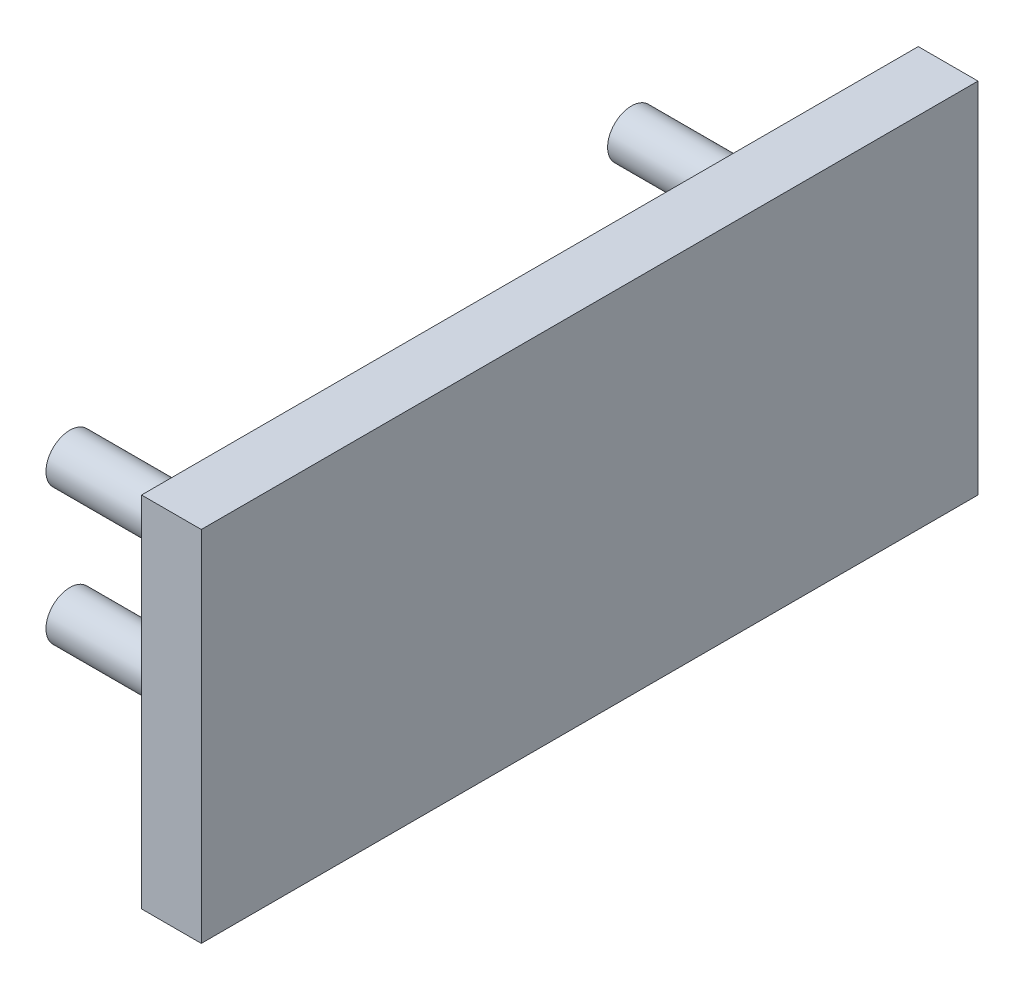
ISO-10303-21;
HEADER;
FILE_DESCRIPTION(('STEP AP214'),'2;1');
FILE_NAME('part.step','',(''),(''),'','','');
FILE_SCHEMA(('AUTOMOTIVE_DESIGN { 1 0 10303 214 1 1 1 1 }'));
ENDSEC;
DATA;
#1=APPLICATION_CONTEXT('core data for automotive mechanical design processes');
#2=APPLICATION_PROTOCOL_DEFINITION('international standard','automotive_design',2000,#1);
#3=PRODUCT_CONTEXT('',#1,'mechanical');
#4=PRODUCT('Part','Part','',(#3));
#5=PRODUCT_RELATED_PRODUCT_CATEGORY('part','',(#4));
#6=PRODUCT_DEFINITION_FORMATION('','',#4);
#7=PRODUCT_DEFINITION_CONTEXT('part definition',#1,'design');
#8=PRODUCT_DEFINITION('design','',#6,#7);
#9=PRODUCT_DEFINITION_SHAPE('','',#8);
#10=(LENGTH_UNIT() NAMED_UNIT(*) SI_UNIT(.MILLI.,.METRE.));
#11=(NAMED_UNIT(*) PLANE_ANGLE_UNIT() SI_UNIT($,.RADIAN.));
#12=(NAMED_UNIT(*) SI_UNIT($,.STERADIAN.) SOLID_ANGLE_UNIT());
#13=UNCERTAINTY_MEASURE_WITH_UNIT(LENGTH_MEASURE(1.E-05),#10,'distance_accuracy_value','');
#14=(GEOMETRIC_REPRESENTATION_CONTEXT(3) GLOBAL_UNCERTAINTY_ASSIGNED_CONTEXT((#13)) GLOBAL_UNIT_ASSIGNED_CONTEXT((#10,
#11,#12)) REPRESENTATION_CONTEXT('',''));
#15=CARTESIAN_POINT('',(0.,0.,0.));
#16=DIRECTION('',(0.,0.,1.));
#17=DIRECTION('',(1.,0.,0.));
#18=AXIS2_PLACEMENT_3D('',#15,#16,#17);
#19=CARTESIAN_POINT('',(5.,15.,-32.5));
#20=DIRECTION('',(0.,-1.,0.));
#21=DIRECTION('',(0.,0.,-1.));
#22=AXIS2_PLACEMENT_3D('',#19,#20,#21);
#23=PLANE('',#22);
#24=DIRECTION('',(0.,0.,1.));
#25=VECTOR('',#24,1.);
#26=CARTESIAN_POINT('',(0.,15.,-32.5));
#27=LINE('',#26,#25);
#28=CARTESIAN_POINT('',(0.,15.,-32.5));
#29=VERTEX_POINT('',#28);
#30=CARTESIAN_POINT('',(0.,15.,32.5));
#31=VERTEX_POINT('',#30);
#32=EDGE_CURVE('E113',#29,#31,#27,.T.);
#33=ORIENTED_EDGE('',*,*,#32,.T.);
#34=DIRECTION('',(-1.,0.,0.));
#35=VECTOR('',#34,1.);
#36=CARTESIAN_POINT('',(5.,15.,32.5));
#37=LINE('',#36,#35);
#38=CARTESIAN_POINT('',(5.,15.,32.5));
#39=VERTEX_POINT('',#38);
#40=EDGE_CURVE('E11',#39,#31,#37,.T.);
#41=ORIENTED_EDGE('',*,*,#40,.F.);
#42=DIRECTION('',(0.,0.,1.));
#43=VECTOR('',#42,1.);
#44=CARTESIAN_POINT('',(5.,15.,-32.5));
#45=LINE('',#44,#43);
#46=CARTESIAN_POINT('',(5.,15.,-32.5));
#47=VERTEX_POINT('',#46);
#48=EDGE_CURVE('E97',#47,#39,#45,.T.);
#49=ORIENTED_EDGE('',*,*,#48,.F.);
#50=DIRECTION('',(-1.,0.,0.));
#51=VECTOR('',#50,1.);
#52=CARTESIAN_POINT('',(5.,15.,-32.5));
#53=LINE('',#52,#51);
#54=EDGE_CURVE('E109',#47,#29,#53,.T.);
#55=ORIENTED_EDGE('',*,*,#54,.T.);
#56=EDGE_LOOP('',(#33,#41,#49,#55));
#57=FACE_BOUND('',#56,.T.);
#58=ADVANCED_FACE('F45',(#57),#23,.F.);
#59=CARTESIAN_POINT('',(5.,-15.,32.5));
#60=DIRECTION('',(0.,0.,-1.));
#61=DIRECTION('',(-1.,0.,0.));
#62=AXIS2_PLACEMENT_3D('',#59,#60,#61);
#63=PLANE('',#62);
#64=DIRECTION('',(0.,-1.,0.));
#65=VECTOR('',#64,1.);
#66=CARTESIAN_POINT('',(0.,-15.,32.5));
#67=LINE('',#66,#65);
#68=CARTESIAN_POINT('',(0.,-15.,32.5));
#69=VERTEX_POINT('',#68);
#70=EDGE_CURVE('E102',#31,#69,#67,.T.);
#71=ORIENTED_EDGE('',*,*,#70,.T.);
#72=DIRECTION('',(-1.,0.,0.));
#73=VECTOR('',#72,1.);
#74=CARTESIAN_POINT('',(5.,-15.,32.5));
#75=LINE('',#74,#73);
#76=CARTESIAN_POINT('',(5.,-15.,32.5));
#77=VERTEX_POINT('',#76);
#78=EDGE_CURVE('E54',#77,#69,#75,.T.);
#79=ORIENTED_EDGE('',*,*,#78,.F.);
#80=DIRECTION('',(0.,-1.,0.));
#81=VECTOR('',#80,1.);
#82=CARTESIAN_POINT('',(5.,-15.,32.5));
#83=LINE('',#82,#81);
#84=EDGE_CURVE('E92',#39,#77,#83,.T.);
#85=ORIENTED_EDGE('',*,*,#84,.F.);
#86=ORIENTED_EDGE('',*,*,#40,.T.);
#87=EDGE_LOOP('',(#71,#79,#85,#86));
#88=FACE_BOUND('',#87,.T.);
#89=ADVANCED_FACE('F101',(#88),#63,.F.);
#90=CARTESIAN_POINT('',(5.,-15.,-32.5));
#91=DIRECTION('',(0.,1.,0.));
#92=DIRECTION('',(0.,0.,1.));
#93=AXIS2_PLACEMENT_3D('',#90,#91,#92);
#94=PLANE('',#93);
#95=DIRECTION('',(0.,0.,-1.));
#96=VECTOR('',#95,1.);
#97=CARTESIAN_POINT('',(0.,-15.,-32.5));
#98=LINE('',#97,#96);
#99=CARTESIAN_POINT('',(0.,-15.,-32.5));
#100=VERTEX_POINT('',#99);
#101=EDGE_CURVE('E79',#69,#100,#98,.T.);
#102=ORIENTED_EDGE('',*,*,#101,.T.);
#103=DIRECTION('',(-1.,0.,0.));
#104=VECTOR('',#103,1.);
#105=CARTESIAN_POINT('',(5.,-15.,-32.5));
#106=LINE('',#105,#104);
#107=CARTESIAN_POINT('',(5.,-15.,-32.5));
#108=VERTEX_POINT('',#107);
#109=EDGE_CURVE('E104',#108,#100,#106,.T.);
#110=ORIENTED_EDGE('',*,*,#109,.F.);
#111=DIRECTION('',(0.,0.,-1.));
#112=VECTOR('',#111,1.);
#113=CARTESIAN_POINT('',(5.,-15.,-32.5));
#114=LINE('',#113,#112);
#115=EDGE_CURVE('E95',#77,#108,#114,.T.);
#116=ORIENTED_EDGE('',*,*,#115,.F.);
#117=ORIENTED_EDGE('',*,*,#78,.T.);
#118=EDGE_LOOP('',(#102,#110,#116,#117));
#119=FACE_BOUND('',#118,.T.);
#120=ADVANCED_FACE('F105',(#119),#94,.F.);
#121=CARTESIAN_POINT('',(5.,-15.,-32.5));
#122=DIRECTION('',(0.,0.,1.));
#123=DIRECTION('',(1.,0.,0.));
#124=AXIS2_PLACEMENT_3D('',#121,#122,#123);
#125=PLANE('',#124);
#126=DIRECTION('',(0.,1.,0.));
#127=VECTOR('',#126,1.);
#128=CARTESIAN_POINT('',(0.,-15.,-32.5));
#129=LINE('',#128,#127);
#130=EDGE_CURVE('E85',#100,#29,#129,.T.);
#131=ORIENTED_EDGE('',*,*,#130,.T.);
#132=ORIENTED_EDGE('',*,*,#54,.F.);
#133=DIRECTION('',(0.,1.,0.));
#134=VECTOR('',#133,1.);
#135=CARTESIAN_POINT('',(5.,-15.,-32.5));
#136=LINE('',#135,#134);
#137=EDGE_CURVE('E62',#108,#47,#136,.T.);
#138=ORIENTED_EDGE('',*,*,#137,.F.);
#139=ORIENTED_EDGE('',*,*,#109,.T.);
#140=EDGE_LOOP('',(#131,#132,#138,#139));
#141=FACE_BOUND('',#140,.T.);
#142=ADVANCED_FACE('F127',(#141),#125,.F.);
#143=CARTESIAN_POINT('',(5.,0.,0.));
#144=DIRECTION('',(-1.,0.,0.));
#145=DIRECTION('',(0.,0.,1.));
#146=AXIS2_PLACEMENT_3D('',#143,#144,#145);
#147=PLANE('',#146);
#148=ORIENTED_EDGE('',*,*,#48,.T.);
#149=ORIENTED_EDGE('',*,*,#84,.T.);
#150=ORIENTED_EDGE('',*,*,#115,.T.);
#151=ORIENTED_EDGE('',*,*,#137,.T.);
#152=EDGE_LOOP('',(#148,#149,#150,#151));
#153=FACE_BOUND('',#152,.T.);
#154=ADVANCED_FACE('F93',(#153),#147,.F.);
#155=CARTESIAN_POINT('',(0.,0.,0.));
#156=DIRECTION('',(-1.,0.,0.));
#157=DIRECTION('',(0.,0.,1.));
#158=AXIS2_PLACEMENT_3D('',#155,#156,#157);
#159=PLANE('',#158);
#160=CARTESIAN_POINT('',(0.,5.7,23.5));
#161=DIRECTION('',(-1.,0.,0.));
#162=DIRECTION('',(0.,0.,-1.));
#163=AXIS2_PLACEMENT_3D('',#160,#161,#162);
#164=CIRCLE('',#163,2.);
#165=CARTESIAN_POINT('',(0.,5.7,21.5));
#166=VERTEX_POINT('',#165);
#167=EDGE_CURVE('E138',#166,#166,#164,.T.);
#168=ORIENTED_EDGE('',*,*,#167,.F.);
#169=EDGE_LOOP('',(#168));
#170=FACE_BOUND('',#169,.T.);
#171=CARTESIAN_POINT('',(0.,-5.7,-23.5));
#172=DIRECTION('',(-1.,0.,0.));
#173=DIRECTION('',(0.,0.,-1.));
#174=AXIS2_PLACEMENT_3D('',#171,#172,#173);
#175=CIRCLE('',#174,2.);
#176=CARTESIAN_POINT('',(0.,-5.7,-25.5));
#177=VERTEX_POINT('',#176);
#178=EDGE_CURVE('E146',#177,#177,#175,.T.);
#179=ORIENTED_EDGE('',*,*,#178,.F.);
#180=EDGE_LOOP('',(#179));
#181=FACE_BOUND('',#180,.T.);
#182=CARTESIAN_POINT('',(0.,-5.7,23.5));
#183=DIRECTION('',(-1.,0.,0.));
#184=DIRECTION('',(0.,0.,1.));
#185=AXIS2_PLACEMENT_3D('',#182,#183,#184);
#186=CIRCLE('',#185,2.);
#187=CARTESIAN_POINT('',(0.,-5.7,21.5));
#188=VERTEX_POINT('',#187);
#189=EDGE_CURVE('E147',#188,#188,#186,.T.);
#190=ORIENTED_EDGE('',*,*,#189,.F.);
#191=EDGE_LOOP('',(#190));
#192=FACE_BOUND('',#191,.T.);
#193=CARTESIAN_POINT('',(0.,5.7,-23.5));
#194=DIRECTION('',(-1.,0.,0.));
#195=DIRECTION('',(0.,0.,1.));
#196=AXIS2_PLACEMENT_3D('',#193,#194,#195);
#197=CIRCLE('',#196,2.);
#198=CARTESIAN_POINT('',(0.,5.7,-25.5));
#199=VERTEX_POINT('',#198);
#200=EDGE_CURVE('E134',#199,#199,#197,.T.);
#201=ORIENTED_EDGE('',*,*,#200,.F.);
#202=EDGE_LOOP('',(#201));
#203=FACE_BOUND('',#202,.T.);
#204=ORIENTED_EDGE('',*,*,#32,.F.);
#205=ORIENTED_EDGE('',*,*,#130,.F.);
#206=ORIENTED_EDGE('',*,*,#101,.F.);
#207=ORIENTED_EDGE('',*,*,#70,.F.);
#208=EDGE_LOOP('',(#204,#205,#206,#207));
#209=FACE_BOUND('',#208,.T.);
#210=ADVANCED_FACE('F130',(#170,#181,#192,#203,#209),#159,.T.);
#211=CARTESIAN_POINT('',(-15.,5.7,-23.5));
#212=DIRECTION('',(1.,0.,0.));
#213=DIRECTION('',(0.,0.,-1.));
#214=AXIS2_PLACEMENT_3D('',#211,#212,#213);
#215=CYLINDRICAL_SURFACE('',#214,2.);
#216=CARTESIAN_POINT('',(-15.,5.7,-23.5));
#217=DIRECTION('',(-1.,0.,0.));
#218=DIRECTION('',(0.,0.,1.));
#219=AXIS2_PLACEMENT_3D('',#216,#217,#218);
#220=CIRCLE('',#219,2.);
#221=CARTESIAN_POINT('',(-15.,5.7,-25.5));
#222=VERTEX_POINT('',#221);
#223=EDGE_CURVE('E117',#222,#222,#220,.T.);
#224=CARTESIAN_POINT('',(-15.,5.7,-25.5));
#225=CARTESIAN_POINT('',(-14.84375,5.7,-25.5));
#226=CARTESIAN_POINT('',(-14.6875,5.7,-25.5));
#227=CARTESIAN_POINT('',(-14.375,5.7,-25.5));
#228=CARTESIAN_POINT('',(-14.21875,5.7,-25.5));
#229=CARTESIAN_POINT('',(-13.90625,5.7,-25.5));
#230=CARTESIAN_POINT('',(-13.75,5.7,-25.5));
#231=CARTESIAN_POINT('',(-13.4375,5.7,-25.5));
#232=CARTESIAN_POINT('',(-13.28125,5.7,-25.5));
#233=CARTESIAN_POINT('',(-12.96875,5.7,-25.5));
#234=CARTESIAN_POINT('',(-12.8125,5.7,-25.5));
#235=CARTESIAN_POINT('',(-12.5,5.7,-25.5));
#236=CARTESIAN_POINT('',(-12.34375,5.7,-25.5));
#237=CARTESIAN_POINT('',(-12.03125,5.7,-25.5));
#238=CARTESIAN_POINT('',(-11.875,5.7,-25.5));
#239=CARTESIAN_POINT('',(-11.5625,5.7,-25.5));
#240=CARTESIAN_POINT('',(-11.40625,5.7,-25.5));
#241=CARTESIAN_POINT('',(-11.09375,5.7,-25.5));
#242=CARTESIAN_POINT('',(-10.9375,5.7,-25.5));
#243=CARTESIAN_POINT('',(-10.625,5.7,-25.5));
#244=CARTESIAN_POINT('',(-10.46875,5.7,-25.5));
#245=CARTESIAN_POINT('',(-10.15625,5.7,-25.5));
#246=CARTESIAN_POINT('',(-10.,5.7,-25.5));
#247=CARTESIAN_POINT('',(-9.6875,5.7,-25.5));
#248=CARTESIAN_POINT('',(-9.53125,5.7,-25.5));
#249=CARTESIAN_POINT('',(-9.21875,5.7,-25.5));
#250=CARTESIAN_POINT('',(-9.0625,5.7,-25.5));
#251=CARTESIAN_POINT('',(-8.75,5.7,-25.5));
#252=CARTESIAN_POINT('',(-8.59375,5.7,-25.5));
#253=CARTESIAN_POINT('',(-8.28125,5.7,-25.5));
#254=CARTESIAN_POINT('',(-8.125,5.7,-25.5));
#255=CARTESIAN_POINT('',(-7.8125,5.7,-25.5));
#256=CARTESIAN_POINT('',(-7.65625,5.7,-25.5));
#257=CARTESIAN_POINT('',(-7.34375,5.7,-25.5));
#258=CARTESIAN_POINT('',(-7.1875,5.7,-25.5));
#259=CARTESIAN_POINT('',(-6.875,5.7,-25.5));
#260=CARTESIAN_POINT('',(-6.71875,5.7,-25.5));
#261=CARTESIAN_POINT('',(-6.40625,5.7,-25.5));
#262=CARTESIAN_POINT('',(-6.25,5.7,-25.5));
#263=CARTESIAN_POINT('',(-5.9375,5.7,-25.5));
#264=CARTESIAN_POINT('',(-5.78125,5.7,-25.5));
#265=CARTESIAN_POINT('',(-5.46875,5.7,-25.5));
#266=CARTESIAN_POINT('',(-5.3125,5.7,-25.5));
#267=CARTESIAN_POINT('',(-5.,5.7,-25.5));
#268=CARTESIAN_POINT('',(-4.84375,5.7,-25.5));
#269=CARTESIAN_POINT('',(-4.53125,5.7,-25.5));
#270=CARTESIAN_POINT('',(-4.375,5.7,-25.5));
#271=CARTESIAN_POINT('',(-4.0625,5.7,-25.5));
#272=CARTESIAN_POINT('',(-3.90625,5.7,-25.5));
#273=CARTESIAN_POINT('',(-3.59375,5.7,-25.5));
#274=CARTESIAN_POINT('',(-3.4375,5.7,-25.5));
#275=CARTESIAN_POINT('',(-3.125,5.7,-25.5));
#276=CARTESIAN_POINT('',(-2.96875,5.7,-25.5));
#277=CARTESIAN_POINT('',(-2.65625,5.7,-25.5));
#278=CARTESIAN_POINT('',(-2.5,5.7,-25.5));
#279=CARTESIAN_POINT('',(-2.1875,5.7,-25.5));
#280=CARTESIAN_POINT('',(-2.03125,5.7,-25.5));
#281=CARTESIAN_POINT('',(-1.71875,5.7,-25.5));
#282=CARTESIAN_POINT('',(-1.5625,5.7,-25.5));
#283=CARTESIAN_POINT('',(-1.25,5.7,-25.5));
#284=CARTESIAN_POINT('',(-1.09375,5.7,-25.5));
#285=CARTESIAN_POINT('',(-0.781250000000001,5.7,-25.5));
#286=CARTESIAN_POINT('',(-0.625000000000001,5.7,-25.5));
#287=CARTESIAN_POINT('',(-0.3125,5.7,-25.5));
#288=CARTESIAN_POINT('',(-0.15625,5.7,-25.5));
#289=CARTESIAN_POINT('',(0.,5.7,-25.5));
#290=B_SPLINE_CURVE_WITH_KNOTS('',3,(#224,#225,#226,#227,#228,#229,#230,#231,#232,#233,#234,
#235,#236,#237,#238,#239,#240,#241,#242,#243,#244,#245,#246,#247,#248,#249,#250,#251,#252,#253,
#254,#255,#256,#257,#258,#259,#260,#261,#262,#263,#264,#265,#266,#267,#268,#269,#270,#271,#272,
#273,#274,#275,#276,#277,#278,#279,#280,#281,#282,#283,#284,#285,#286,#287,#288,#289),
.UNSPECIFIED.,.F.,.F.,(4,2,2,2,2,2,2,2,2,2,2,2,2,2,2,2,2,2,2,2,2,2,2,2,2,2,2,2,2,2,2,2,4),(0.,
0.468749999999999,0.937499999999999,1.40625,1.875,2.34375,2.8125,3.28125,3.75,4.21875,4.6875,
5.15625,5.625,6.09375,6.5625,7.03125,7.5,7.96875,8.4375,8.90625,9.375,9.84375,10.3125,10.78125,
11.25,11.71875,12.1875,12.65625,13.125,13.59375,14.0625,14.53125,15.),.UNSPECIFIED.);
#291=EDGE_CURVE('BSEAM170',#222,#199,#290,.T.);
#292=ORIENTED_EDGE('',*,*,#223,.F.);
#293=ORIENTED_EDGE('',*,*,#200,.T.);
#294=ORIENTED_EDGE('',*,*,#291,.T.);
#295=ORIENTED_EDGE('',*,*,#291,.F.);
#296=EDGE_LOOP('',(#292,#294,#293,#295));
#297=FACE_BOUND('',#296,.T.);
#298=ADVANCED_FACE('F170',(#297),#215,.T.);
#299=CARTESIAN_POINT('',(-15.,5.7,-23.5));
#300=DIRECTION('',(-1.,0.,0.));
#301=DIRECTION('',(0.,0.,1.));
#302=AXIS2_PLACEMENT_3D('',#299,#300,#301);
#303=PLANE('',#302);
#304=ORIENTED_EDGE('',*,*,#223,.T.);
#305=EDGE_LOOP('',(#304));
#306=FACE_BOUND('',#305,.T.);
#307=ADVANCED_FACE('F176',(#306),#303,.T.);
#308=CARTESIAN_POINT('',(-15.,-5.7,23.5));
#309=DIRECTION('',(1.,0.,0.));
#310=DIRECTION('',(0.,0.,-1.));
#311=AXIS2_PLACEMENT_3D('',#308,#309,#310);
#312=CYLINDRICAL_SURFACE('',#311,2.);
#313=CARTESIAN_POINT('',(-15.,-5.7,23.5));
#314=DIRECTION('',(-1.,0.,0.));
#315=DIRECTION('',(0.,0.,1.));
#316=AXIS2_PLACEMENT_3D('',#313,#314,#315);
#317=CIRCLE('',#316,2.);
#318=CARTESIAN_POINT('',(-15.,-5.7,21.5));
#319=VERTEX_POINT('',#318);
#320=EDGE_CURVE('E158',#319,#319,#317,.T.);
#321=CARTESIAN_POINT('',(-15.,-5.7,21.5));
#322=CARTESIAN_POINT('',(-14.84375,-5.7,21.5));
#323=CARTESIAN_POINT('',(-14.6875,-5.7,21.5));
#324=CARTESIAN_POINT('',(-14.375,-5.7,21.5));
#325=CARTESIAN_POINT('',(-14.21875,-5.7,21.5));
#326=CARTESIAN_POINT('',(-13.90625,-5.7,21.5));
#327=CARTESIAN_POINT('',(-13.75,-5.7,21.5));
#328=CARTESIAN_POINT('',(-13.4375,-5.7,21.5));
#329=CARTESIAN_POINT('',(-13.28125,-5.7,21.5));
#330=CARTESIAN_POINT('',(-12.96875,-5.7,21.5));
#331=CARTESIAN_POINT('',(-12.8125,-5.7,21.5));
#332=CARTESIAN_POINT('',(-12.5,-5.7,21.5));
#333=CARTESIAN_POINT('',(-12.34375,-5.7,21.5));
#334=CARTESIAN_POINT('',(-12.03125,-5.7,21.5));
#335=CARTESIAN_POINT('',(-11.875,-5.7,21.5));
#336=CARTESIAN_POINT('',(-11.5625,-5.7,21.5));
#337=CARTESIAN_POINT('',(-11.40625,-5.7,21.5));
#338=CARTESIAN_POINT('',(-11.09375,-5.7,21.5));
#339=CARTESIAN_POINT('',(-10.9375,-5.7,21.5));
#340=CARTESIAN_POINT('',(-10.625,-5.7,21.5));
#341=CARTESIAN_POINT('',(-10.46875,-5.7,21.5));
#342=CARTESIAN_POINT('',(-10.15625,-5.7,21.5));
#343=CARTESIAN_POINT('',(-10.,-5.7,21.5));
#344=CARTESIAN_POINT('',(-9.6875,-5.7,21.5));
#345=CARTESIAN_POINT('',(-9.53125,-5.7,21.5));
#346=CARTESIAN_POINT('',(-9.21875,-5.7,21.5));
#347=CARTESIAN_POINT('',(-9.0625,-5.7,21.5));
#348=CARTESIAN_POINT('',(-8.75,-5.7,21.5));
#349=CARTESIAN_POINT('',(-8.59375,-5.7,21.5));
#350=CARTESIAN_POINT('',(-8.28125,-5.7,21.5));
#351=CARTESIAN_POINT('',(-8.125,-5.7,21.5));
#352=CARTESIAN_POINT('',(-7.8125,-5.7,21.5));
#353=CARTESIAN_POINT('',(-7.65625,-5.7,21.5));
#354=CARTESIAN_POINT('',(-7.34375,-5.7,21.5));
#355=CARTESIAN_POINT('',(-7.1875,-5.7,21.5));
#356=CARTESIAN_POINT('',(-6.875,-5.7,21.5));
#357=CARTESIAN_POINT('',(-6.71875,-5.7,21.5));
#358=CARTESIAN_POINT('',(-6.40625,-5.7,21.5));
#359=CARTESIAN_POINT('',(-6.25,-5.7,21.5));
#360=CARTESIAN_POINT('',(-5.9375,-5.7,21.5));
#361=CARTESIAN_POINT('',(-5.78125,-5.7,21.5));
#362=CARTESIAN_POINT('',(-5.46875,-5.7,21.5));
#363=CARTESIAN_POINT('',(-5.3125,-5.7,21.5));
#364=CARTESIAN_POINT('',(-5.,-5.7,21.5));
#365=CARTESIAN_POINT('',(-4.84375,-5.7,21.5));
#366=CARTESIAN_POINT('',(-4.53125,-5.7,21.5));
#367=CARTESIAN_POINT('',(-4.375,-5.7,21.5));
#368=CARTESIAN_POINT('',(-4.0625,-5.7,21.5));
#369=CARTESIAN_POINT('',(-3.90625,-5.7,21.5));
#370=CARTESIAN_POINT('',(-3.59375,-5.7,21.5));
#371=CARTESIAN_POINT('',(-3.4375,-5.7,21.5));
#372=CARTESIAN_POINT('',(-3.125,-5.7,21.5));
#373=CARTESIAN_POINT('',(-2.96875,-5.7,21.5));
#374=CARTESIAN_POINT('',(-2.65625,-5.7,21.5));
#375=CARTESIAN_POINT('',(-2.5,-5.7,21.5));
#376=CARTESIAN_POINT('',(-2.1875,-5.7,21.5));
#377=CARTESIAN_POINT('',(-2.03125,-5.7,21.5));
#378=CARTESIAN_POINT('',(-1.71875,-5.7,21.5));
#379=CARTESIAN_POINT('',(-1.5625,-5.7,21.5));
#380=CARTESIAN_POINT('',(-1.25,-5.7,21.5));
#381=CARTESIAN_POINT('',(-1.09375,-5.7,21.5));
#382=CARTESIAN_POINT('',(-0.781250000000001,-5.7,21.5));
#383=CARTESIAN_POINT('',(-0.625000000000001,-5.7,21.5));
#384=CARTESIAN_POINT('',(-0.3125,-5.7,21.5));
#385=CARTESIAN_POINT('',(-0.15625,-5.7,21.5));
#386=CARTESIAN_POINT('',(0.,-5.7,21.5));
#387=B_SPLINE_CURVE_WITH_KNOTS('',3,(#321,#322,#323,#324,#325,#326,#327,#328,#329,#330,#331,
#332,#333,#334,#335,#336,#337,#338,#339,#340,#341,#342,#343,#344,#345,#346,#347,#348,#349,#350,
#351,#352,#353,#354,#355,#356,#357,#358,#359,#360,#361,#362,#363,#364,#365,#366,#367,#368,#369,
#370,#371,#372,#373,#374,#375,#376,#377,#378,#379,#380,#381,#382,#383,#384,#385,#386),
.UNSPECIFIED.,.F.,.F.,(4,2,2,2,2,2,2,2,2,2,2,2,2,2,2,2,2,2,2,2,2,2,2,2,2,2,2,2,2,2,2,2,4),(0.,
0.468749999999999,0.937499999999999,1.40625,1.875,2.34375,2.8125,3.28125,3.75,4.21875,4.6875,
5.15625,5.625,6.09375,6.5625,7.03125,7.5,7.96875,8.4375,8.90625,9.375,9.84375,10.3125,10.78125,
11.25,11.71875,12.1875,12.65625,13.125,13.59375,14.0625,14.53125,15.),.UNSPECIFIED.);
#388=EDGE_CURVE('BSEAM166',#319,#188,#387,.T.);
#389=ORIENTED_EDGE('',*,*,#320,.F.);
#390=ORIENTED_EDGE('',*,*,#189,.T.);
#391=ORIENTED_EDGE('',*,*,#388,.T.);
#392=ORIENTED_EDGE('',*,*,#388,.F.);
#393=EDGE_LOOP('',(#389,#391,#390,#392));
#394=FACE_BOUND('',#393,.T.);
#395=ADVANCED_FACE('F166',(#394),#312,.T.);
#396=CARTESIAN_POINT('',(-15.,-5.7,23.5));
#397=DIRECTION('',(-1.,0.,0.));
#398=DIRECTION('',(0.,0.,1.));
#399=AXIS2_PLACEMENT_3D('',#396,#397,#398);
#400=PLANE('',#399);
#401=ORIENTED_EDGE('',*,*,#320,.T.);
#402=EDGE_LOOP('',(#401));
#403=FACE_BOUND('',#402,.T.);
#404=ADVANCED_FACE('F226',(#403),#400,.T.);
#405=CARTESIAN_POINT('',(-15.,-5.7,-23.5));
#406=DIRECTION('',(1.,0.,0.));
#407=DIRECTION('',(0.,0.,-1.));
#408=AXIS2_PLACEMENT_3D('',#405,#406,#407);
#409=CYLINDRICAL_SURFACE('',#408,2.);
#410=CARTESIAN_POINT('',(-15.,-5.7,-23.5));
#411=DIRECTION('',(-1.,0.,0.));
#412=DIRECTION('',(0.,0.,-1.));
#413=AXIS2_PLACEMENT_3D('',#410,#411,#412);
#414=CIRCLE('',#413,2.);
#415=CARTESIAN_POINT('',(-15.,-5.7,-25.5));
#416=VERTEX_POINT('',#415);
#417=EDGE_CURVE('E142',#416,#416,#414,.T.);
#418=CARTESIAN_POINT('',(-15.,-5.7,-25.5));
#419=CARTESIAN_POINT('',(-14.84375,-5.7,-25.5));
#420=CARTESIAN_POINT('',(-14.6875,-5.7,-25.5));
#421=CARTESIAN_POINT('',(-14.375,-5.7,-25.5));
#422=CARTESIAN_POINT('',(-14.21875,-5.7,-25.5));
#423=CARTESIAN_POINT('',(-13.90625,-5.7,-25.5));
#424=CARTESIAN_POINT('',(-13.75,-5.7,-25.5));
#425=CARTESIAN_POINT('',(-13.4375,-5.7,-25.5));
#426=CARTESIAN_POINT('',(-13.28125,-5.7,-25.5));
#427=CARTESIAN_POINT('',(-12.96875,-5.7,-25.5));
#428=CARTESIAN_POINT('',(-12.8125,-5.7,-25.5));
#429=CARTESIAN_POINT('',(-12.5,-5.7,-25.5));
#430=CARTESIAN_POINT('',(-12.34375,-5.7,-25.5));
#431=CARTESIAN_POINT('',(-12.03125,-5.7,-25.5));
#432=CARTESIAN_POINT('',(-11.875,-5.7,-25.5));
#433=CARTESIAN_POINT('',(-11.5625,-5.7,-25.5));
#434=CARTESIAN_POINT('',(-11.40625,-5.7,-25.5));
#435=CARTESIAN_POINT('',(-11.09375,-5.7,-25.5));
#436=CARTESIAN_POINT('',(-10.9375,-5.7,-25.5));
#437=CARTESIAN_POINT('',(-10.625,-5.7,-25.5));
#438=CARTESIAN_POINT('',(-10.46875,-5.7,-25.5));
#439=CARTESIAN_POINT('',(-10.15625,-5.7,-25.5));
#440=CARTESIAN_POINT('',(-10.,-5.7,-25.5));
#441=CARTESIAN_POINT('',(-9.6875,-5.7,-25.5));
#442=CARTESIAN_POINT('',(-9.53125,-5.7,-25.5));
#443=CARTESIAN_POINT('',(-9.21875,-5.7,-25.5));
#444=CARTESIAN_POINT('',(-9.0625,-5.7,-25.5));
#445=CARTESIAN_POINT('',(-8.75,-5.7,-25.5));
#446=CARTESIAN_POINT('',(-8.59375,-5.7,-25.5));
#447=CARTESIAN_POINT('',(-8.28125,-5.7,-25.5));
#448=CARTESIAN_POINT('',(-8.125,-5.7,-25.5));
#449=CARTESIAN_POINT('',(-7.8125,-5.7,-25.5));
#450=CARTESIAN_POINT('',(-7.65625,-5.7,-25.5));
#451=CARTESIAN_POINT('',(-7.34375,-5.7,-25.5));
#452=CARTESIAN_POINT('',(-7.1875,-5.7,-25.5));
#453=CARTESIAN_POINT('',(-6.875,-5.7,-25.5));
#454=CARTESIAN_POINT('',(-6.71875,-5.7,-25.5));
#455=CARTESIAN_POINT('',(-6.40625,-5.7,-25.5));
#456=CARTESIAN_POINT('',(-6.25,-5.7,-25.5));
#457=CARTESIAN_POINT('',(-5.9375,-5.7,-25.5));
#458=CARTESIAN_POINT('',(-5.78125,-5.7,-25.5));
#459=CARTESIAN_POINT('',(-5.46875,-5.7,-25.5));
#460=CARTESIAN_POINT('',(-5.3125,-5.7,-25.5));
#461=CARTESIAN_POINT('',(-5.,-5.7,-25.5));
#462=CARTESIAN_POINT('',(-4.84375,-5.7,-25.5));
#463=CARTESIAN_POINT('',(-4.53125,-5.7,-25.5));
#464=CARTESIAN_POINT('',(-4.375,-5.7,-25.5));
#465=CARTESIAN_POINT('',(-4.0625,-5.7,-25.5));
#466=CARTESIAN_POINT('',(-3.90625,-5.7,-25.5));
#467=CARTESIAN_POINT('',(-3.59375,-5.7,-25.5));
#468=CARTESIAN_POINT('',(-3.4375,-5.7,-25.5));
#469=CARTESIAN_POINT('',(-3.125,-5.7,-25.5));
#470=CARTESIAN_POINT('',(-2.96875,-5.7,-25.5));
#471=CARTESIAN_POINT('',(-2.65625,-5.7,-25.5));
#472=CARTESIAN_POINT('',(-2.5,-5.7,-25.5));
#473=CARTESIAN_POINT('',(-2.1875,-5.7,-25.5));
#474=CARTESIAN_POINT('',(-2.03125,-5.7,-25.5));
#475=CARTESIAN_POINT('',(-1.71875,-5.7,-25.5));
#476=CARTESIAN_POINT('',(-1.5625,-5.7,-25.5));
#477=CARTESIAN_POINT('',(-1.25,-5.7,-25.5));
#478=CARTESIAN_POINT('',(-1.09375,-5.7,-25.5));
#479=CARTESIAN_POINT('',(-0.781250000000001,-5.7,-25.5));
#480=CARTESIAN_POINT('',(-0.625000000000001,-5.7,-25.5));
#481=CARTESIAN_POINT('',(-0.3125,-5.7,-25.5));
#482=CARTESIAN_POINT('',(-0.15625,-5.7,-25.5));
#483=CARTESIAN_POINT('',(0.,-5.7,-25.5));
#484=B_SPLINE_CURVE_WITH_KNOTS('',3,(#418,#419,#420,#421,#422,#423,#424,#425,#426,#427,#428,
#429,#430,#431,#432,#433,#434,#435,#436,#437,#438,#439,#440,#441,#442,#443,#444,#445,#446,#447,
#448,#449,#450,#451,#452,#453,#454,#455,#456,#457,#458,#459,#460,#461,#462,#463,#464,#465,#466,
#467,#468,#469,#470,#471,#472,#473,#474,#475,#476,#477,#478,#479,#480,#481,#482,#483),
.UNSPECIFIED.,.F.,.F.,(4,2,2,2,2,2,2,2,2,2,2,2,2,2,2,2,2,2,2,2,2,2,2,2,2,2,2,2,2,2,2,2,4),(0.,
0.468749999999999,0.937499999999999,1.40625,1.875,2.34375,2.8125,3.28125,3.75,4.21875,4.6875,
5.15625,5.625,6.09375,6.5625,7.03125,7.5,7.96875,8.4375,8.90625,9.375,9.84375,10.3125,10.78125,
11.25,11.71875,12.1875,12.65625,13.125,13.59375,14.0625,14.53125,15.),.UNSPECIFIED.);
#485=EDGE_CURVE('BSEAM236',#416,#177,#484,.T.);
#486=ORIENTED_EDGE('',*,*,#417,.F.);
#487=ORIENTED_EDGE('',*,*,#178,.T.);
#488=ORIENTED_EDGE('',*,*,#485,.T.);
#489=ORIENTED_EDGE('',*,*,#485,.F.);
#490=EDGE_LOOP('',(#486,#488,#487,#489));
#491=FACE_BOUND('',#490,.T.);
#492=ADVANCED_FACE('F236',(#491),#409,.T.);
#493=CARTESIAN_POINT('',(-15.,-5.7,-23.5));
#494=DIRECTION('',(1.,0.,0.));
#495=DIRECTION('',(0.,0.,-1.));
#496=AXIS2_PLACEMENT_3D('',#493,#494,#495);
#497=PLANE('',#496);
#498=ORIENTED_EDGE('',*,*,#417,.T.);
#499=EDGE_LOOP('',(#498));
#500=FACE_BOUND('',#499,.T.);
#501=ADVANCED_FACE('F246',(#500),#497,.F.);
#502=CARTESIAN_POINT('',(-15.,5.7,23.5));
#503=DIRECTION('',(1.,0.,0.));
#504=DIRECTION('',(0.,0.,-1.));
#505=AXIS2_PLACEMENT_3D('',#502,#503,#504);
#506=CYLINDRICAL_SURFACE('',#505,2.);
#507=CARTESIAN_POINT('',(-15.,5.7,23.5));
#508=DIRECTION('',(-1.,0.,0.));
#509=DIRECTION('',(0.,0.,-1.));
#510=AXIS2_PLACEMENT_3D('',#507,#508,#509);
#511=CIRCLE('',#510,2.);
#512=CARTESIAN_POINT('',(-15.,5.7,21.5));
#513=VERTEX_POINT('',#512);
#514=EDGE_CURVE('E151',#513,#513,#511,.T.);
#515=CARTESIAN_POINT('',(-15.,5.7,21.5));
#516=CARTESIAN_POINT('',(-14.84375,5.7,21.5));
#517=CARTESIAN_POINT('',(-14.6875,5.7,21.5));
#518=CARTESIAN_POINT('',(-14.375,5.7,21.5));
#519=CARTESIAN_POINT('',(-14.21875,5.7,21.5));
#520=CARTESIAN_POINT('',(-13.90625,5.7,21.5));
#521=CARTESIAN_POINT('',(-13.75,5.7,21.5));
#522=CARTESIAN_POINT('',(-13.4375,5.7,21.5));
#523=CARTESIAN_POINT('',(-13.28125,5.7,21.5));
#524=CARTESIAN_POINT('',(-12.96875,5.7,21.5));
#525=CARTESIAN_POINT('',(-12.8125,5.7,21.5));
#526=CARTESIAN_POINT('',(-12.5,5.7,21.5));
#527=CARTESIAN_POINT('',(-12.34375,5.7,21.5));
#528=CARTESIAN_POINT('',(-12.03125,5.7,21.5));
#529=CARTESIAN_POINT('',(-11.875,5.7,21.5));
#530=CARTESIAN_POINT('',(-11.5625,5.7,21.5));
#531=CARTESIAN_POINT('',(-11.40625,5.7,21.5));
#532=CARTESIAN_POINT('',(-11.09375,5.7,21.5));
#533=CARTESIAN_POINT('',(-10.9375,5.7,21.5));
#534=CARTESIAN_POINT('',(-10.625,5.7,21.5));
#535=CARTESIAN_POINT('',(-10.46875,5.7,21.5));
#536=CARTESIAN_POINT('',(-10.15625,5.7,21.5));
#537=CARTESIAN_POINT('',(-10.,5.7,21.5));
#538=CARTESIAN_POINT('',(-9.6875,5.7,21.5));
#539=CARTESIAN_POINT('',(-9.53125,5.7,21.5));
#540=CARTESIAN_POINT('',(-9.21875,5.7,21.5));
#541=CARTESIAN_POINT('',(-9.0625,5.7,21.5));
#542=CARTESIAN_POINT('',(-8.75,5.7,21.5));
#543=CARTESIAN_POINT('',(-8.59375,5.7,21.5));
#544=CARTESIAN_POINT('',(-8.28125,5.7,21.5));
#545=CARTESIAN_POINT('',(-8.125,5.7,21.5));
#546=CARTESIAN_POINT('',(-7.8125,5.7,21.5));
#547=CARTESIAN_POINT('',(-7.65625,5.7,21.5));
#548=CARTESIAN_POINT('',(-7.34375,5.7,21.5));
#549=CARTESIAN_POINT('',(-7.1875,5.7,21.5));
#550=CARTESIAN_POINT('',(-6.875,5.7,21.5));
#551=CARTESIAN_POINT('',(-6.71875,5.7,21.5));
#552=CARTESIAN_POINT('',(-6.40625,5.7,21.5));
#553=CARTESIAN_POINT('',(-6.25,5.7,21.5));
#554=CARTESIAN_POINT('',(-5.9375,5.7,21.5));
#555=CARTESIAN_POINT('',(-5.78125,5.7,21.5));
#556=CARTESIAN_POINT('',(-5.46875,5.7,21.5));
#557=CARTESIAN_POINT('',(-5.3125,5.7,21.5));
#558=CARTESIAN_POINT('',(-5.,5.7,21.5));
#559=CARTESIAN_POINT('',(-4.84375,5.7,21.5));
#560=CARTESIAN_POINT('',(-4.53125,5.7,21.5));
#561=CARTESIAN_POINT('',(-4.375,5.7,21.5));
#562=CARTESIAN_POINT('',(-4.0625,5.7,21.5));
#563=CARTESIAN_POINT('',(-3.90625,5.7,21.5));
#564=CARTESIAN_POINT('',(-3.59375,5.7,21.5));
#565=CARTESIAN_POINT('',(-3.4375,5.7,21.5));
#566=CARTESIAN_POINT('',(-3.125,5.7,21.5));
#567=CARTESIAN_POINT('',(-2.96875,5.7,21.5));
#568=CARTESIAN_POINT('',(-2.65625,5.7,21.5));
#569=CARTESIAN_POINT('',(-2.5,5.7,21.5));
#570=CARTESIAN_POINT('',(-2.1875,5.7,21.5));
#571=CARTESIAN_POINT('',(-2.03125,5.7,21.5));
#572=CARTESIAN_POINT('',(-1.71875,5.7,21.5));
#573=CARTESIAN_POINT('',(-1.5625,5.7,21.5));
#574=CARTESIAN_POINT('',(-1.25,5.7,21.5));
#575=CARTESIAN_POINT('',(-1.09375,5.7,21.5));
#576=CARTESIAN_POINT('',(-0.781250000000001,5.7,21.5));
#577=CARTESIAN_POINT('',(-0.625000000000001,5.7,21.5));
#578=CARTESIAN_POINT('',(-0.3125,5.7,21.5));
#579=CARTESIAN_POINT('',(-0.15625,5.7,21.5));
#580=CARTESIAN_POINT('',(0.,5.7,21.5));
#581=B_SPLINE_CURVE_WITH_KNOTS('',3,(#515,#516,#517,#518,#519,#520,#521,#522,#523,#524,#525,
#526,#527,#528,#529,#530,#531,#532,#533,#534,#535,#536,#537,#538,#539,#540,#541,#542,#543,#544,
#545,#546,#547,#548,#549,#550,#551,#552,#553,#554,#555,#556,#557,#558,#559,#560,#561,#562,#563,
#564,#565,#566,#567,#568,#569,#570,#571,#572,#573,#574,#575,#576,#577,#578,#579,#580),
.UNSPECIFIED.,.F.,.F.,(4,2,2,2,2,2,2,2,2,2,2,2,2,2,2,2,2,2,2,2,2,2,2,2,2,2,2,2,2,2,2,2,4),(0.,
0.468749999999999,0.937499999999999,1.40625,1.875,2.34375,2.8125,3.28125,3.75,4.21875,4.6875,
5.15625,5.625,6.09375,6.5625,7.03125,7.5,7.96875,8.4375,8.90625,9.375,9.84375,10.3125,10.78125,
11.25,11.71875,12.1875,12.65625,13.125,13.59375,14.0625,14.53125,15.),.UNSPECIFIED.);
#582=EDGE_CURVE('BSEAM256',#513,#166,#581,.T.);
#583=ORIENTED_EDGE('',*,*,#514,.F.);
#584=ORIENTED_EDGE('',*,*,#167,.T.);
#585=ORIENTED_EDGE('',*,*,#582,.T.);
#586=ORIENTED_EDGE('',*,*,#582,.F.);
#587=EDGE_LOOP('',(#583,#585,#584,#586));
#588=FACE_BOUND('',#587,.T.);
#589=ADVANCED_FACE('F256',(#588),#506,.T.);
#590=CARTESIAN_POINT('',(-15.,5.7,23.5));
#591=DIRECTION('',(1.,0.,0.));
#592=DIRECTION('',(0.,0.,-1.));
#593=AXIS2_PLACEMENT_3D('',#590,#591,#592);
#594=PLANE('',#593);
#595=ORIENTED_EDGE('',*,*,#514,.T.);
#596=EDGE_LOOP('',(#595));
#597=FACE_BOUND('',#596,.T.);
#598=ADVANCED_FACE('F266',(#597),#594,.F.);
#599=CLOSED_SHELL('',(#58,#89,#120,#142,#154,#210,#298,#307,#395,#404,#492,#501,#589,#598));
#600=MANIFOLD_SOLID_BREP('B2',#599);
#601=ADVANCED_BREP_SHAPE_REPRESENTATION('',(#18,#600),#14);
#602=SHAPE_DEFINITION_REPRESENTATION(#9,#601);
ENDSEC;
END-ISO-10303-21;
